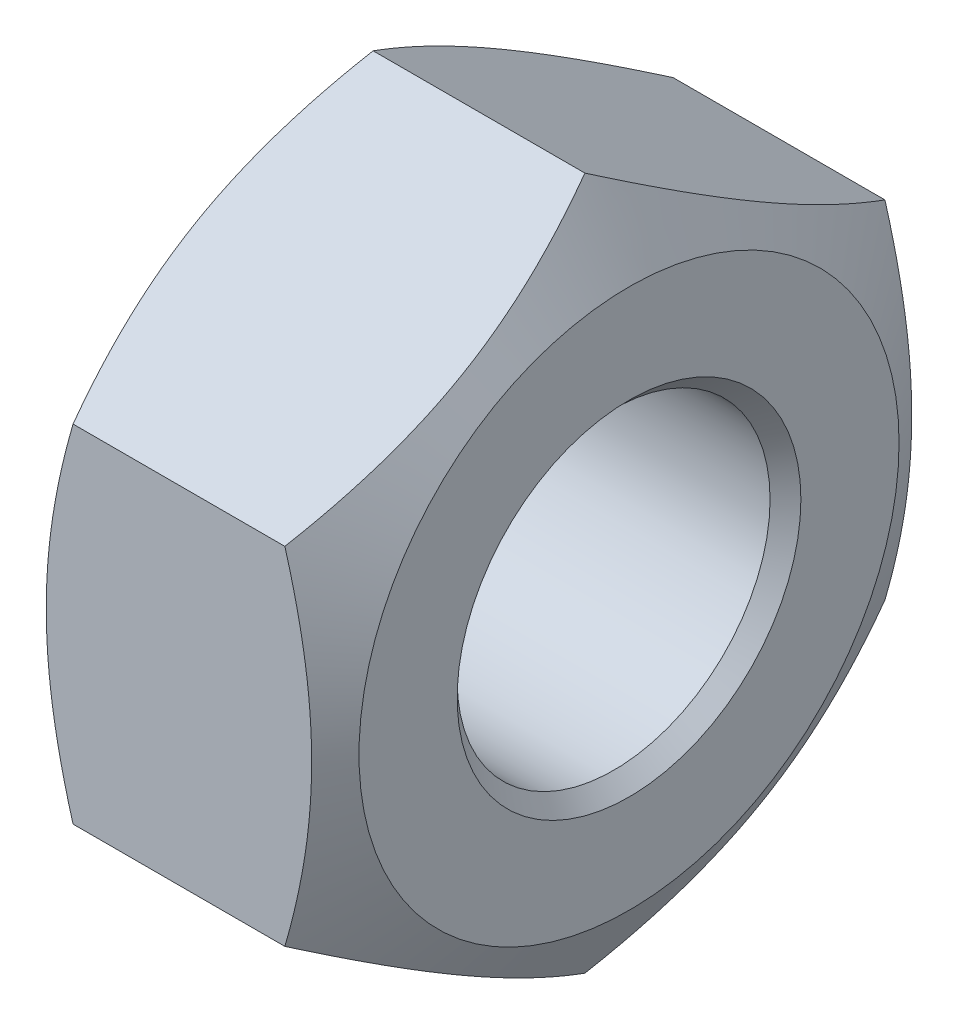
ISO-10303-21;
HEADER;
FILE_DESCRIPTION(('STEP AP214'),'2;1');
FILE_NAME('part.step','',(''),(''),'','','');
FILE_SCHEMA(('AUTOMOTIVE_DESIGN { 1 0 10303 214 1 1 1 1 }'));
ENDSEC;
DATA;
#1=APPLICATION_CONTEXT('core data for automotive mechanical design processes');
#2=APPLICATION_PROTOCOL_DEFINITION('international standard','automotive_design',2000,#1);
#3=PRODUCT_CONTEXT('',#1,'mechanical');
#4=PRODUCT('Part','Part','',(#3));
#5=PRODUCT_RELATED_PRODUCT_CATEGORY('part','',(#4));
#6=PRODUCT_DEFINITION_FORMATION('','',#4);
#7=PRODUCT_DEFINITION_CONTEXT('part definition',#1,'design');
#8=PRODUCT_DEFINITION('design','',#6,#7);
#9=PRODUCT_DEFINITION_SHAPE('','',#8);
#10=(LENGTH_UNIT() NAMED_UNIT(*) SI_UNIT(.MILLI.,.METRE.));
#11=(NAMED_UNIT(*) PLANE_ANGLE_UNIT() SI_UNIT($,.RADIAN.));
#12=(NAMED_UNIT(*) SI_UNIT($,.STERADIAN.) SOLID_ANGLE_UNIT());
#13=UNCERTAINTY_MEASURE_WITH_UNIT(LENGTH_MEASURE(1.E-05),#10,'distance_accuracy_value','');
#14=(GEOMETRIC_REPRESENTATION_CONTEXT(3) GLOBAL_UNCERTAINTY_ASSIGNED_CONTEXT((#13)) GLOBAL_UNIT_ASSIGNED_CONTEXT((#10,
#11,#12)) REPRESENTATION_CONTEXT('',''));
#15=CARTESIAN_POINT('',(0.,0.,0.));
#16=DIRECTION('',(0.,0.,1.));
#17=DIRECTION('',(1.,0.,0.));
#18=AXIS2_PLACEMENT_3D('',#15,#16,#17);
#19=CARTESIAN_POINT('',(0.2,0.,0.));
#20=DIRECTION('',(-1.,0.,0.));
#21=DIRECTION('',(0.,0.,1.));
#22=AXIS2_PLACEMENT_3D('',#19,#20,#21);
#23=CONICAL_SURFACE('',#22,3.5235,0.785398163397448);
#24=CARTESIAN_POINT('',(0.,0.,0.));
#25=DIRECTION('',(-1.,0.,0.));
#26=DIRECTION('',(0.,0.,1.));
#27=AXIS2_PLACEMENT_3D('',#24,#25,#26);
#28=CIRCLE('',#27,3.7235);
#29=CARTESIAN_POINT('',(0.,0.,-3.7235));
#30=VERTEX_POINT('',#29);
#31=EDGE_CURVE('E11',#30,#30,#28,.T.);
#32=ORIENTED_EDGE('',*,*,#31,.T.);
#33=DIRECTION('',(0.707106781186548,0.,0.707106781186548));
#34=VECTOR('',#33,1.);
#35=CARTESIAN_POINT('',(0.2,0.,-3.5235));
#36=LINE('',#35,#34);
#37=CARTESIAN_POINT('',(0.33375,0.,-3.38975));
#38=VERTEX_POINT('',#37);
#39=EDGE_CURVE('E29',#30,#38,#36,.T.);
#40=ORIENTED_EDGE('',*,*,#39,.T.);
#41=CARTESIAN_POINT('',(0.33375,0.,0.));
#42=DIRECTION('',(1.,0.,0.));
#43=DIRECTION('',(0.,0.,-1.));
#44=AXIS2_PLACEMENT_3D('',#41,#42,#43);
#45=CIRCLE('',#44,3.38975);
#46=CARTESIAN_POINT('',(0.33375,0.,3.38975));
#47=VERTEX_POINT('',#46);
#48=EDGE_CURVE('E50',#38,#47,#45,.T.);
#49=ORIENTED_EDGE('',*,*,#48,.T.);
#50=CARTESIAN_POINT('',(0.33375,0.,0.));
#51=DIRECTION('',(1.,0.,0.));
#52=DIRECTION('',(0.,0.,-1.));
#53=AXIS2_PLACEMENT_3D('',#50,#51,#52);
#54=CIRCLE('',#53,3.38975);
#55=EDGE_CURVE('E178',#47,#38,#54,.T.);
#56=ORIENTED_EDGE('',*,*,#55,.T.);
#57=ORIENTED_EDGE('',*,*,#39,.F.);
#58=EDGE_LOOP('',(#32,#40,#49,#56,#57));
#59=FACE_BOUND('',#58,.T.);
#60=ADVANCED_FACE('F17',(#59),#23,.F.);
#61=CARTESIAN_POINT('',(6.5,0.,0.));
#62=DIRECTION('',(1.,0.,0.));
#63=DIRECTION('',(0.,0.,-1.));
#64=AXIS2_PLACEMENT_3D('',#61,#62,#63);
#65=CYLINDRICAL_SURFACE('',#64,3.38975);
#66=ORIENTED_EDGE('',*,*,#55,.F.);
#67=DIRECTION('',(1.,0.,0.));
#68=VECTOR('',#67,1.);
#69=CARTESIAN_POINT('',(6.5,0.,3.38975));
#70=LINE('',#69,#68);
#71=CARTESIAN_POINT('',(6.16625,0.,3.38975));
#72=VERTEX_POINT('',#71);
#73=EDGE_CURVE('E188',#47,#72,#70,.T.);
#74=ORIENTED_EDGE('',*,*,#73,.T.);
#75=CARTESIAN_POINT('',(6.16625,0.,0.));
#76=DIRECTION('',(-1.,0.,0.));
#77=DIRECTION('',(0.,0.,-1.));
#78=AXIS2_PLACEMENT_3D('',#75,#76,#77);
#79=CIRCLE('',#78,3.38975);
#80=CARTESIAN_POINT('',(6.16625,0.,-3.38975));
#81=VERTEX_POINT('',#80);
#82=EDGE_CURVE('E245',#81,#72,#79,.T.);
#83=ORIENTED_EDGE('',*,*,#82,.F.);
#84=CARTESIAN_POINT('',(6.16625,0.,0.));
#85=DIRECTION('',(-1.,0.,0.));
#86=DIRECTION('',(0.,0.,-1.));
#87=AXIS2_PLACEMENT_3D('',#84,#85,#86);
#88=CIRCLE('',#87,3.38975);
#89=EDGE_CURVE('E195',#72,#81,#88,.T.);
#90=ORIENTED_EDGE('',*,*,#89,.F.);
#91=ORIENTED_EDGE('',*,*,#73,.F.);
#92=ORIENTED_EDGE('',*,*,#48,.F.);
#93=EDGE_LOOP('',(#66,#74,#83,#90,#91,#92));
#94=FACE_BOUND('',#93,.T.);
#95=ADVANCED_FACE('F385',(#94),#65,.F.);
#96=CARTESIAN_POINT('',(0.,0.,0.));
#97=DIRECTION('',(1.,0.,0.));
#98=DIRECTION('',(0.,1.,0.));
#99=AXIS2_PLACEMENT_3D('',#96,#97,#98);
#100=PLANE('',#99);
#101=CARTESIAN_POINT('',(0.,0.,0.));
#102=DIRECTION('',(1.,0.,0.));
#103=DIRECTION('',(0.,0.,-1.));
#104=AXIS2_PLACEMENT_3D('',#101,#102,#103);
#105=CIRCLE('',#104,5.85);
#106=CARTESIAN_POINT('',(0.,0.,5.85));
#107=VERTEX_POINT('',#106);
#108=EDGE_CURVE('E211',#107,#107,#105,.T.);
#109=ORIENTED_EDGE('',*,*,#108,.F.);
#110=EDGE_LOOP('',(#109));
#111=FACE_BOUND('',#110,.T.);
#112=ORIENTED_EDGE('',*,*,#31,.F.);
#113=EDGE_LOOP('',(#112));
#114=FACE_BOUND('',#113,.T.);
#115=ADVANCED_FACE('F391',(#111,#114),#100,.F.);
#116=CARTESIAN_POINT('',(6.3,0.,0.));
#117=DIRECTION('',(1.,0.,0.));
#118=DIRECTION('',(0.,0.,1.));
#119=AXIS2_PLACEMENT_3D('',#116,#117,#118);
#120=CONICAL_SURFACE('',#119,3.5235,0.785398163397448);
#121=ORIENTED_EDGE('',*,*,#89,.T.);
#122=DIRECTION('',(0.707106781186548,0.,-0.707106781186548));
#123=VECTOR('',#122,1.);
#124=CARTESIAN_POINT('',(6.3,0.,-3.5235));
#125=LINE('',#124,#123);
#126=CARTESIAN_POINT('',(6.5,0.,-3.7235));
#127=VERTEX_POINT('',#126);
#128=EDGE_CURVE('E255',#81,#127,#125,.T.);
#129=ORIENTED_EDGE('',*,*,#128,.T.);
#130=CARTESIAN_POINT('',(6.5,0.,0.));
#131=DIRECTION('',(1.,0.,0.));
#132=DIRECTION('',(0.,0.,1.));
#133=AXIS2_PLACEMENT_3D('',#130,#131,#132);
#134=CIRCLE('',#133,3.7235);
#135=EDGE_CURVE('E247',#127,#127,#134,.T.);
#136=ORIENTED_EDGE('',*,*,#135,.T.);
#137=ORIENTED_EDGE('',*,*,#128,.F.);
#138=ORIENTED_EDGE('',*,*,#82,.T.);
#139=EDGE_LOOP('',(#121,#129,#136,#137,#138));
#140=FACE_BOUND('',#139,.T.);
#141=ADVANCED_FACE('F363',(#140),#120,.F.);
#142=CARTESIAN_POINT('',(6.5,5.85,0.));
#143=DIRECTION('',(-1.,0.,0.));
#144=DIRECTION('',(0.,0.,1.));
#145=AXIS2_PLACEMENT_3D('',#142,#143,#144);
#146=PLANE('',#145);
#147=CARTESIAN_POINT('',(6.5,0.,0.));
#148=DIRECTION('',(1.,0.,0.));
#149=DIRECTION('',(0.,0.,-1.));
#150=AXIS2_PLACEMENT_3D('',#147,#148,#149);
#151=CIRCLE('',#150,5.85);
#152=CARTESIAN_POINT('',(6.5,0.,-5.85));
#153=VERTEX_POINT('',#152);
#154=EDGE_CURVE('E202',#153,#153,#151,.T.);
#155=ORIENTED_EDGE('',*,*,#154,.T.);
#156=EDGE_LOOP('',(#155));
#157=FACE_BOUND('',#156,.T.);
#158=ORIENTED_EDGE('',*,*,#135,.F.);
#159=EDGE_LOOP('',(#158));
#160=FACE_BOUND('',#159,.T.);
#161=ADVANCED_FACE('F358',(#157,#160),#146,.F.);
#162=CARTESIAN_POINT('',(0.,0.,0.));
#163=DIRECTION('',(1.,0.,0.));
#164=DIRECTION('',(0.,0.,-1.));
#165=AXIS2_PLACEMENT_3D('',#162,#163,#164);
#166=CONICAL_SURFACE('',#165,5.85,1.0471975511966);
#167=CARTESIAN_POINT('',(0.955834258579358,3.75277674972331,6.50000000001602));
#168=CARTESIAN_POINT('',(-0.127499074763316,5.62916512459886,3.25));
#169=CARTESIAN_POINT('',(0.955834258579356,7.50555349947437,-1.60216735666899E-11));
#170=(BOUNDED_CURVE() B_SPLINE_CURVE(2,(#167,#168,#169),.UNSPECIFIED.,.F.,
.F.) B_SPLINE_CURVE_WITH_KNOTS((3,3),(-2.59950177741173,-1.15141591145917),
.UNSPECIFIED.) CURVE() GEOMETRIC_REPRESENTATION_ITEM() RATIONAL_B_SPLINE_CURVE((1.79091727885955,
2.06797314609437,1.79091727885955)) REPRESENTATION_ITEM(''));
#171=CARTESIAN_POINT('',(0.955834258574024,3.75277674973257,6.5));
#172=VERTEX_POINT('',#171);
#173=CARTESIAN_POINT('',(0.955834258574024,7.50555349946513,0.));
#174=VERTEX_POINT('',#173);
#175=EDGE_CURVE('E196',#172,#174,#170,.T.);
#176=ORIENTED_EDGE('',*,*,#175,.T.);
#177=CARTESIAN_POINT('',(0.955834258579356,7.50555349947437,1.60087792587368E-11));
#178=CARTESIAN_POINT('',(-0.127499074763311,5.62916512459886,-3.25));
#179=CARTESIAN_POINT('',(0.955834258579358,3.75277674972333,-6.50000000001602));
#180=(BOUNDED_CURVE() B_SPLINE_CURVE(2,(#177,#178,#179),.UNSPECIFIED.,.F.,
.F.) B_SPLINE_CURVE_WITH_KNOTS((3,3),(-2.59950177741173,-1.15141591145917),
.UNSPECIFIED.) CURVE() GEOMETRIC_REPRESENTATION_ITEM() RATIONAL_B_SPLINE_CURVE((1.79091727885955,
2.06797314609437,1.79091727885955)) REPRESENTATION_ITEM(''));
#181=CARTESIAN_POINT('',(0.955834258574024,3.75277674973257,-6.5));
#182=VERTEX_POINT('',#181);
#183=EDGE_CURVE('E203',#174,#182,#180,.T.);
#184=ORIENTED_EDGE('',*,*,#183,.T.);
#185=CARTESIAN_POINT('',(0.955834258579367,3.75277674975109,-6.5));
#186=CARTESIAN_POINT('',(-0.127499074763319,0.,-6.5));
#187=CARTESIAN_POINT('',(0.955834258579367,-3.75277674975109,-6.5));
#188=(BOUNDED_CURVE() B_SPLINE_CURVE(2,(#185,#186,#187),.UNSPECIFIED.,.F.,
.F.) B_SPLINE_CURVE_WITH_KNOTS((3,3),(-2.59983756323217,-1.15161428154278),
.UNSPECIFIED.) CURVE() GEOMETRIC_REPRESENTATION_ITEM() RATIONAL_B_SPLINE_CURVE((1.79107545461672,
2.06815579172634,1.79107545461672)) REPRESENTATION_ITEM(''));
#189=CARTESIAN_POINT('',(0.955834258574024,-3.75277674973257,-6.5));
#190=VERTEX_POINT('',#189);
#191=EDGE_CURVE('E218',#182,#190,#188,.T.);
#192=ORIENTED_EDGE('',*,*,#191,.T.);
#193=CARTESIAN_POINT('',(0.955834258579358,-3.75277674972331,-6.50000000001602));
#194=CARTESIAN_POINT('',(-0.127499074763316,-5.62916512459886,-3.25));
#195=CARTESIAN_POINT('',(0.955834258579356,-7.50555349947437,1.60216735666899E-11));
#196=(BOUNDED_CURVE() B_SPLINE_CURVE(2,(#193,#194,#195),.UNSPECIFIED.,.F.,
.F.) B_SPLINE_CURVE_WITH_KNOTS((3,3),(-2.59950177741173,-1.15141591145917),
.UNSPECIFIED.) CURVE() GEOMETRIC_REPRESENTATION_ITEM() RATIONAL_B_SPLINE_CURVE((1.79091727885955,
2.06797314609437,1.79091727885955)) REPRESENTATION_ITEM(''));
#197=CARTESIAN_POINT('',(0.955834258574024,-7.50555349946513,0.));
#198=VERTEX_POINT('',#197);
#199=EDGE_CURVE('E227',#190,#198,#196,.T.);
#200=ORIENTED_EDGE('',*,*,#199,.T.);
#201=CARTESIAN_POINT('',(0.955834258579356,-7.50555349947437,-1.60087792587368E-11));
#202=CARTESIAN_POINT('',(-0.12749907476331,-5.62916512459886,3.25));
#203=CARTESIAN_POINT('',(0.955834258579358,-3.75277674972333,6.50000000001602));
#204=(BOUNDED_CURVE() B_SPLINE_CURVE(2,(#201,#202,#203),.UNSPECIFIED.,.F.,
.F.) B_SPLINE_CURVE_WITH_KNOTS((3,3),(-2.59950177741173,-1.15141591145917),
.UNSPECIFIED.) CURVE() GEOMETRIC_REPRESENTATION_ITEM() RATIONAL_B_SPLINE_CURVE((1.79091727885955,
2.06797314609437,1.79091727885955)) REPRESENTATION_ITEM(''));
#205=CARTESIAN_POINT('',(0.955834258574023,-3.75277674973257,6.5));
#206=VERTEX_POINT('',#205);
#207=EDGE_CURVE('E165',#198,#206,#204,.T.);
#208=ORIENTED_EDGE('',*,*,#207,.T.);
#209=CARTESIAN_POINT('',(0.955834258579367,-3.7527767497511,6.5));
#210=CARTESIAN_POINT('',(0.375277674973256,-1.74166975080974,6.5));
#211=CARTESIAN_POINT('',(0.375277674973256,0.,6.5));
#212=(BOUNDED_CURVE() B_SPLINE_CURVE(2,(#209,#210,#211),.UNSPECIFIED.,.F.,
.F.) B_SPLINE_CURVE_WITH_KNOTS((3,3),(-2.59983756323217,-1.87572592238748),
.UNSPECIFIED.) CURVE() GEOMETRIC_REPRESENTATION_ITEM() RATIONAL_B_SPLINE_CURVE((1.79107545461672,
1.92961562317153,1.92961562317153)) REPRESENTATION_ITEM(''));
#213=CARTESIAN_POINT('',(0.375277674973256,0.,6.5));
#214=VERTEX_POINT('',#213);
#215=EDGE_CURVE('E181',#206,#214,#212,.T.);
#216=ORIENTED_EDGE('',*,*,#215,.T.);
#217=DIRECTION('',(-0.5,0.,-0.86602540378444));
#218=VECTOR('',#217,1.);
#219=CARTESIAN_POINT('',(0.,0.,5.85));
#220=LINE('',#219,#218);
#221=EDGE_CURVE('E187',#214,#107,#220,.T.);
#222=ORIENTED_EDGE('',*,*,#221,.T.);
#223=ORIENTED_EDGE('',*,*,#108,.T.);
#224=ORIENTED_EDGE('',*,*,#221,.F.);
#225=CARTESIAN_POINT('',(0.375277674973256,0.,6.5));
#226=CARTESIAN_POINT('',(0.375277674973256,1.74166975080974,6.5));
#227=CARTESIAN_POINT('',(0.955834258579367,3.75277674975109,6.5));
#228=(BOUNDED_CURVE() B_SPLINE_CURVE(2,(#225,#226,#227),.UNSPECIFIED.,.F.,
.F.) B_SPLINE_CURVE_WITH_KNOTS((3,3),(-1.87572592238748,-1.15161428154278),
.UNSPECIFIED.) CURVE() GEOMETRIC_REPRESENTATION_ITEM() RATIONAL_B_SPLINE_CURVE((1.92961562317153,
1.92961562317153,1.79107545461672)) REPRESENTATION_ITEM(''));
#229=EDGE_CURVE('E204',#214,#172,#228,.T.);
#230=ORIENTED_EDGE('',*,*,#229,.T.);
#231=EDGE_LOOP('',(#176,#184,#192,#200,#208,#216,#222,#223,#224,#230));
#232=FACE_BOUND('',#231,.T.);
#233=ADVANCED_FACE('F320',(#232),#166,.T.);
#234=CARTESIAN_POINT('',(5.37416697508023,0.,0.));
#235=DIRECTION('',(-1.,0.,0.));
#236=DIRECTION('',(0.,0.,1.));
#237=AXIS2_PLACEMENT_3D('',#234,#235,#236);
#238=CONICAL_SURFACE('',#237,7.8,1.0471975511966);
#239=CARTESIAN_POINT('',(5.54416574141882,7.50555349947751,-2.14552933662225E-11));
#240=CARTESIAN_POINT('',(6.62749907476467,5.62916512459885,3.25));
#241=CARTESIAN_POINT('',(5.54416574141882,3.75277674972018,6.50000000002146));
#242=(BOUNDED_CURVE() B_SPLINE_CURVE(2,(#239,#240,#241),.UNSPECIFIED.,.F.,
.F.) B_SPLINE_CURVE_WITH_KNOTS((3,3),(-2.67194713467424,-1.19418616900045),
.UNSPECIFIED.) CURVE() GEOMETRIC_REPRESENTATION_ITEM() RATIONAL_B_SPLINE_CURVE((1.82507716907642,
2.1074175897197,1.82507716907642)) REPRESENTATION_ITEM(''));
#243=CARTESIAN_POINT('',(5.54416574142598,7.50555349946513,0.));
#244=VERTEX_POINT('',#243);
#245=CARTESIAN_POINT('',(5.54416574142598,3.75277674973257,6.5));
#246=VERTEX_POINT('',#245);
#247=EDGE_CURVE('E21',#244,#246,#242,.T.);
#248=ORIENTED_EDGE('',*,*,#247,.T.);
#249=CARTESIAN_POINT('',(5.54416574141882,3.75277674975735,6.49999999999999));
#250=CARTESIAN_POINT('',(6.62749907476467,0.,6.49999999999999));
#251=CARTESIAN_POINT('',(5.54416574141882,-3.75277674975735,6.49999999999999));
#252=(BOUNDED_CURVE() B_SPLINE_CURVE(2,(#249,#250,#251),.UNSPECIFIED.,.F.,
.F.) B_SPLINE_CURVE_WITH_KNOTS((3,3),(-2.67194713467424,-1.19418616900045),
.UNSPECIFIED.) CURVE() GEOMETRIC_REPRESENTATION_ITEM() RATIONAL_B_SPLINE_CURVE((1.82507716907642,
2.1074175897197,1.82507716907642)) REPRESENTATION_ITEM(''));
#253=CARTESIAN_POINT('',(5.54416574142598,-3.75277674973257,6.5));
#254=VERTEX_POINT('',#253);
#255=EDGE_CURVE('E156',#246,#254,#252,.T.);
#256=ORIENTED_EDGE('',*,*,#255,.T.);
#257=CARTESIAN_POINT('',(5.54416574141882,-3.75277674972018,6.50000000002145));
#258=CARTESIAN_POINT('',(6.62749907476467,-5.62916512459885,3.25));
#259=CARTESIAN_POINT('',(5.54416574141882,-7.50555349947753,-2.14579699551312E-11));
#260=(BOUNDED_CURVE() B_SPLINE_CURVE(2,(#257,#258,#259),.UNSPECIFIED.,.F.,
.F.) B_SPLINE_CURVE_WITH_KNOTS((3,3),(-2.67194713467424,-1.19418616900045),
.UNSPECIFIED.) CURVE() GEOMETRIC_REPRESENTATION_ITEM() RATIONAL_B_SPLINE_CURVE((1.82507716907641,
2.10741758971969,1.82507716907641)) REPRESENTATION_ITEM(''));
#261=CARTESIAN_POINT('',(5.54416574142598,-7.50555349946513,0.));
#262=VERTEX_POINT('',#261);
#263=EDGE_CURVE('E152',#254,#262,#260,.T.);
#264=ORIENTED_EDGE('',*,*,#263,.T.);
#265=CARTESIAN_POINT('',(5.54416574141882,-7.50555349947751,2.14552933662225E-11));
#266=CARTESIAN_POINT('',(6.62749907476467,-5.62916512459885,-3.25));
#267=CARTESIAN_POINT('',(5.54416574141882,-3.75277674972018,-6.50000000002146));
#268=(BOUNDED_CURVE() B_SPLINE_CURVE(2,(#265,#266,#267),.UNSPECIFIED.,.F.,
.F.) B_SPLINE_CURVE_WITH_KNOTS((3,3),(-2.67194713467424,-1.19418616900045),
.UNSPECIFIED.) CURVE() GEOMETRIC_REPRESENTATION_ITEM() RATIONAL_B_SPLINE_CURVE((1.82507716907642,
2.1074175897197,1.82507716907642)) REPRESENTATION_ITEM(''));
#269=CARTESIAN_POINT('',(5.54416574142598,-3.75277674973257,-6.5));
#270=VERTEX_POINT('',#269);
#271=EDGE_CURVE('E144',#262,#270,#268,.T.);
#272=ORIENTED_EDGE('',*,*,#271,.T.);
#273=CARTESIAN_POINT('',(5.54416574141882,-3.75277674975734,-6.49999999999999));
#274=CARTESIAN_POINT('',(6.12472232502674,-1.74166975081226,-6.50000000000001));
#275=CARTESIAN_POINT('',(6.12472232502674,0.,-6.50000000000001));
#276=(BOUNDED_CURVE() B_SPLINE_CURVE(2,(#273,#274,#275),.UNSPECIFIED.,.F.,
.F.) B_SPLINE_CURVE_WITH_KNOTS((3,3),(-2.67194713467424,-1.93306665183735),
.UNSPECIFIED.) CURVE() GEOMETRIC_REPRESENTATION_ITEM() RATIONAL_B_SPLINE_CURVE((1.82507716907642,
1.96624737939806,1.96624737939806)) REPRESENTATION_ITEM(''));
#277=CARTESIAN_POINT('',(6.12472232502674,0.,-6.5));
#278=VERTEX_POINT('',#277);
#279=EDGE_CURVE('E153',#270,#278,#276,.T.);
#280=ORIENTED_EDGE('',*,*,#279,.T.);
#281=DIRECTION('',(0.5,0.,0.86602540378444));
#282=VECTOR('',#281,1.);
#283=CARTESIAN_POINT('',(5.37416697508023,0.,-7.8));
#284=LINE('',#283,#282);
#285=EDGE_CURVE('E77',#278,#153,#284,.T.);
#286=ORIENTED_EDGE('',*,*,#285,.T.);
#287=ORIENTED_EDGE('',*,*,#154,.F.);
#288=ORIENTED_EDGE('',*,*,#285,.F.);
#289=CARTESIAN_POINT('',(6.12472232502674,0.,-6.50000000000001));
#290=CARTESIAN_POINT('',(6.12472232502674,1.74166975081226,-6.50000000000001));
#291=CARTESIAN_POINT('',(5.54416574141882,3.75277674975735,-6.49999999999999));
#292=(BOUNDED_CURVE() B_SPLINE_CURVE(2,(#289,#290,#291),.UNSPECIFIED.,.F.,
.F.) B_SPLINE_CURVE_WITH_KNOTS((3,3),(-1.93306665183735,-1.19418616900045),
.UNSPECIFIED.) CURVE() GEOMETRIC_REPRESENTATION_ITEM() RATIONAL_B_SPLINE_CURVE((1.96624737939806,
1.96624737939806,1.82507716907642)) REPRESENTATION_ITEM(''));
#293=CARTESIAN_POINT('',(5.54416574142598,3.75277674973257,-6.5));
#294=VERTEX_POINT('',#293);
#295=EDGE_CURVE('E296',#278,#294,#292,.T.);
#296=ORIENTED_EDGE('',*,*,#295,.T.);
#297=CARTESIAN_POINT('',(5.54416574141882,3.75277674972018,-6.50000000002145));
#298=CARTESIAN_POINT('',(6.62749907476467,5.62916512459885,-3.25));
#299=CARTESIAN_POINT('',(5.54416574141882,7.50555349947753,2.14579699551312E-11));
#300=(BOUNDED_CURVE() B_SPLINE_CURVE(2,(#297,#298,#299),.UNSPECIFIED.,.F.,
.F.) B_SPLINE_CURVE_WITH_KNOTS((3,3),(-2.67194713467424,-1.19418616900045),
.UNSPECIFIED.) CURVE() GEOMETRIC_REPRESENTATION_ITEM() RATIONAL_B_SPLINE_CURVE((1.82507716907641,
2.10741758971969,1.82507716907641)) REPRESENTATION_ITEM(''));
#301=EDGE_CURVE('E91',#294,#244,#300,.T.);
#302=ORIENTED_EDGE('',*,*,#301,.T.);
#303=EDGE_LOOP('',(#248,#256,#264,#272,#280,#286,#287,#288,#296,#302));
#304=FACE_BOUND('',#303,.T.);
#305=ADVANCED_FACE('F19',(#304),#238,.T.);
#306=CARTESIAN_POINT('',(7.5,3.75277674973257,6.5));
#307=DIRECTION('',(0.,0.,-1.));
#308=DIRECTION('',(0.,-1.,0.));
#309=AXIS2_PLACEMENT_3D('',#306,#307,#308);
#310=PLANE('',#309);
#311=DIRECTION('',(-1.,0.,0.));
#312=VECTOR('',#311,1.);
#313=CARTESIAN_POINT('',(7.5,-3.75277674973257,6.5));
#314=LINE('',#313,#312);
#315=EDGE_CURVE('E168',#254,#206,#314,.T.);
#316=ORIENTED_EDGE('',*,*,#315,.F.);
#317=ORIENTED_EDGE('',*,*,#255,.F.);
#318=DIRECTION('',(-1.,0.,0.));
#319=VECTOR('',#318,1.);
#320=CARTESIAN_POINT('',(7.5,3.75277674973257,6.5));
#321=LINE('',#320,#319);
#322=EDGE_CURVE('E238',#246,#172,#321,.T.);
#323=ORIENTED_EDGE('',*,*,#322,.T.);
#324=ORIENTED_EDGE('',*,*,#229,.F.);
#325=ORIENTED_EDGE('',*,*,#215,.F.);
#326=EDGE_LOOP('',(#316,#317,#323,#324,#325));
#327=FACE_BOUND('',#326,.T.);
#328=ADVANCED_FACE('F318',(#327),#310,.F.);
#329=CARTESIAN_POINT('',(7.5,7.50555349946513,0.));
#330=DIRECTION('',(0.,-0.866025403784439,-0.5));
#331=DIRECTION('',(0.,0.5,-0.866025403784439));
#332=AXIS2_PLACEMENT_3D('',#329,#330,#331);
#333=PLANE('',#332);
#334=ORIENTED_EDGE('',*,*,#322,.F.);
#335=ORIENTED_EDGE('',*,*,#247,.F.);
#336=DIRECTION('',(-1.,0.,0.));
#337=VECTOR('',#336,1.);
#338=CARTESIAN_POINT('',(7.5,7.50555349946513,0.));
#339=LINE('',#338,#337);
#340=EDGE_CURVE('E244',#244,#174,#339,.T.);
#341=ORIENTED_EDGE('',*,*,#340,.T.);
#342=ORIENTED_EDGE('',*,*,#175,.F.);
#343=EDGE_LOOP('',(#334,#335,#341,#342));
#344=FACE_BOUND('',#343,.T.);
#345=ADVANCED_FACE('F315',(#344),#333,.F.);
#346=CARTESIAN_POINT('',(7.5,3.75277674973257,-6.5));
#347=DIRECTION('',(0.,-0.866025403784439,0.5));
#348=DIRECTION('',(-1.,0.,0.));
#349=AXIS2_PLACEMENT_3D('',#346,#347,#348);
#350=PLANE('',#349);
#351=ORIENTED_EDGE('',*,*,#340,.F.);
#352=ORIENTED_EDGE('',*,*,#301,.F.);
#353=DIRECTION('',(-1.,0.,0.));
#354=VECTOR('',#353,1.);
#355=CARTESIAN_POINT('',(7.5,3.75277674973257,-6.5));
#356=LINE('',#355,#354);
#357=EDGE_CURVE('E173',#294,#182,#356,.T.);
#358=ORIENTED_EDGE('',*,*,#357,.T.);
#359=ORIENTED_EDGE('',*,*,#183,.F.);
#360=EDGE_LOOP('',(#351,#352,#358,#359));
#361=FACE_BOUND('',#360,.T.);
#362=ADVANCED_FACE('F339',(#361),#350,.F.);
#363=CARTESIAN_POINT('',(7.5,-3.75277674973257,-6.5));
#364=DIRECTION('',(0.,0.,1.));
#365=DIRECTION('',(1.,0.,0.));
#366=AXIS2_PLACEMENT_3D('',#363,#364,#365);
#367=PLANE('',#366);
#368=ORIENTED_EDGE('',*,*,#357,.F.);
#369=ORIENTED_EDGE('',*,*,#295,.F.);
#370=ORIENTED_EDGE('',*,*,#279,.F.);
#371=DIRECTION('',(-1.,0.,0.));
#372=VECTOR('',#371,1.);
#373=CARTESIAN_POINT('',(7.5,-3.75277674973257,-6.5));
#374=LINE('',#373,#372);
#375=EDGE_CURVE('E150',#270,#190,#374,.T.);
#376=ORIENTED_EDGE('',*,*,#375,.T.);
#377=ORIENTED_EDGE('',*,*,#191,.F.);
#378=EDGE_LOOP('',(#368,#369,#370,#376,#377));
#379=FACE_BOUND('',#378,.T.);
#380=ADVANCED_FACE('F334',(#379),#367,.F.);
#381=CARTESIAN_POINT('',(7.5,-7.50555349946513,0.));
#382=DIRECTION('',(0.,0.866025403784439,0.5));
#383=DIRECTION('',(1.,0.,0.));
#384=AXIS2_PLACEMENT_3D('',#381,#382,#383);
#385=PLANE('',#384);
#386=ORIENTED_EDGE('',*,*,#375,.F.);
#387=ORIENTED_EDGE('',*,*,#271,.F.);
#388=DIRECTION('',(-1.,0.,0.));
#389=VECTOR('',#388,1.);
#390=CARTESIAN_POINT('',(7.5,-7.50555349946513,0.));
#391=LINE('',#390,#389);
#392=EDGE_CURVE('E148',#262,#198,#391,.T.);
#393=ORIENTED_EDGE('',*,*,#392,.T.);
#394=ORIENTED_EDGE('',*,*,#199,.F.);
#395=EDGE_LOOP('',(#386,#387,#393,#394));
#396=FACE_BOUND('',#395,.T.);
#397=ADVANCED_FACE('F146',(#396),#385,.F.);
#398=CARTESIAN_POINT('',(7.5,-3.75277674973257,6.5));
#399=DIRECTION('',(0.,0.866025403784439,-0.5));
#400=DIRECTION('',(-1.,0.,0.));
#401=AXIS2_PLACEMENT_3D('',#398,#399,#400);
#402=PLANE('',#401);
#403=ORIENTED_EDGE('',*,*,#392,.F.);
#404=ORIENTED_EDGE('',*,*,#263,.F.);
#405=ORIENTED_EDGE('',*,*,#315,.T.);
#406=ORIENTED_EDGE('',*,*,#207,.F.);
#407=EDGE_LOOP('',(#403,#404,#405,#406));
#408=FACE_BOUND('',#407,.T.);
#409=ADVANCED_FACE('F163',(#408),#402,.F.);
#410=CLOSED_SHELL('',(#60,#95,#115,#141,#161,#233,#305,#328,#345,#362,#380,#397,#409));
#411=MANIFOLD_SOLID_BREP('B1',#410);
#412=ADVANCED_BREP_SHAPE_REPRESENTATION('',(#18,#411),#14);
#413=SHAPE_DEFINITION_REPRESENTATION(#9,#412);
ENDSEC;
END-ISO-10303-21;
